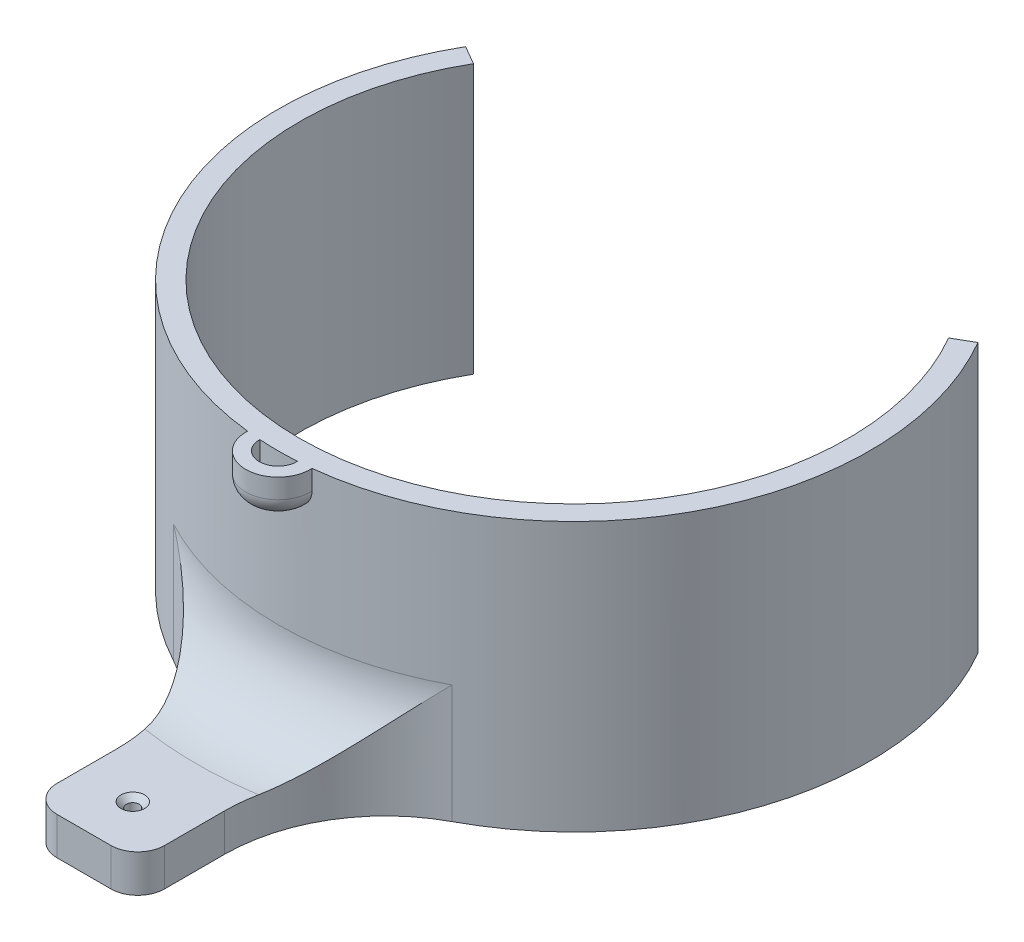
ISO-10303-21;
HEADER;
FILE_DESCRIPTION(('STEP AP214'),'2;1');
FILE_NAME('part.step','',(''),(''),'','','');
FILE_SCHEMA(('AUTOMOTIVE_DESIGN { 1 0 10303 214 1 1 1 1 }'));
ENDSEC;
DATA;
#1=APPLICATION_CONTEXT('core data for automotive mechanical design processes');
#2=APPLICATION_PROTOCOL_DEFINITION('international standard','automotive_design',2000,#1);
#3=PRODUCT_CONTEXT('',#1,'mechanical');
#4=PRODUCT('Part','Part','',(#3));
#5=PRODUCT_RELATED_PRODUCT_CATEGORY('part','',(#4));
#6=PRODUCT_DEFINITION_FORMATION('','',#4);
#7=PRODUCT_DEFINITION_CONTEXT('part definition',#1,'design');
#8=PRODUCT_DEFINITION('design','',#6,#7);
#9=PRODUCT_DEFINITION_SHAPE('','',#8);
#10=(LENGTH_UNIT() NAMED_UNIT(*) SI_UNIT(.MILLI.,.METRE.));
#11=(NAMED_UNIT(*) PLANE_ANGLE_UNIT() SI_UNIT($,.RADIAN.));
#12=(NAMED_UNIT(*) SI_UNIT($,.STERADIAN.) SOLID_ANGLE_UNIT());
#13=UNCERTAINTY_MEASURE_WITH_UNIT(LENGTH_MEASURE(1.E-05),#10,'distance_accuracy_value','');
#14=(GEOMETRIC_REPRESENTATION_CONTEXT(3) GLOBAL_UNCERTAINTY_ASSIGNED_CONTEXT((#13)) GLOBAL_UNIT_ASSIGNED_CONTEXT((#10,
#11,#12)) REPRESENTATION_CONTEXT('',''));
#15=CARTESIAN_POINT('',(0.,0.,0.));
#16=DIRECTION('',(0.,0.,1.));
#17=DIRECTION('',(1.,0.,0.));
#18=AXIS2_PLACEMENT_3D('',#15,#16,#17);
#19=CARTESIAN_POINT('',(0.,50.,0.));
#20=DIRECTION('',(0.,-1.,0.));
#21=DIRECTION('',(0.,0.,-1.));
#22=AXIS2_PLACEMENT_3D('',#19,#20,#21);
#23=CYLINDRICAL_SURFACE('',#22,55.);
#24=DIRECTION('',(0.,1.,0.));
#25=VECTOR('',#24,1.);
#26=CARTESIAN_POINT('',(3.4982278571436,43.,54.8886363636364));
#27=LINE('',#26,#25);
#28=CARTESIAN_POINT('',(3.4982278571436,43.,54.8886363636364));
#29=VERTEX_POINT('',#28);
#30=CARTESIAN_POINT('',(3.4982278571436,50.,54.8886363636364));
#31=VERTEX_POINT('',#30);
#32=EDGE_CURVE('E174',#29,#31,#27,.T.);
#33=ORIENTED_EDGE('',*,*,#32,.T.);
#34=CARTESIAN_POINT('',(0.,50.,0.));
#35=DIRECTION('',(0.,1.,0.));
#36=DIRECTION('',(0.,0.,1.));
#37=AXIS2_PLACEMENT_3D('',#34,#35,#36);
#38=CIRCLE('',#37,55.);
#39=CARTESIAN_POINT('',(-3.4982278571436,50.,54.8886363636364));
#40=VERTEX_POINT('',#39);
#41=EDGE_CURVE('E179',#40,#31,#38,.T.);
#42=ORIENTED_EDGE('',*,*,#41,.F.);
#43=DIRECTION('',(0.,1.,0.));
#44=VECTOR('',#43,1.);
#45=CARTESIAN_POINT('',(-3.4982278571436,43.,54.8886363636364));
#46=LINE('',#45,#44);
#47=CARTESIAN_POINT('',(-3.4982278571436,43.,54.8886363636364));
#48=VERTEX_POINT('',#47);
#49=EDGE_CURVE('E171',#48,#40,#46,.T.);
#50=ORIENTED_EDGE('',*,*,#49,.F.);
#51=CARTESIAN_POINT('',(-3.4982278571436,43.,54.8886363636364));
#52=CARTESIAN_POINT('',(-3.59236589939803,43.0280994679645,54.8826386470958));
#53=CARTESIAN_POINT('',(-3.68529652107505,43.060189742269,54.8764707437336));
#54=CARTESIAN_POINT('',(-3.86810201053047,43.1320834263016,54.8638872410639));
#55=CARTESIAN_POINT('',(-3.95797703763329,43.171886433146,54.8574716547084));
#56=CARTESIAN_POINT('',(-4.13399274128955,43.2589165357481,54.8444883327277));
#57=CARTESIAN_POINT('',(-4.2201354128056,43.3061396014045,54.8379206813361));
#58=CARTESIAN_POINT('',(-4.38810743930372,43.407662172986,54.8247354738007));
#59=CARTESIAN_POINT('',(-4.46993684233435,43.4619616000591,54.8181179182137));
#60=CARTESIAN_POINT('',(-4.70816425054198,43.6349987278606,54.79834404445));
#61=CARTESIAN_POINT('',(-4.85736753230153,43.7639080211404,54.7852615529017));
#62=CARTESIAN_POINT('',(-5.13191310629586,44.044923892924,54.760227959575));
#63=CARTESIAN_POINT('',(-5.25726134994016,44.1970246684628,54.7482765759801));
#64=CARTESIAN_POINT('',(-5.48080430955154,44.5203107590953,54.7263503743881));
#65=CARTESIAN_POINT('',(-5.57898224604407,44.6915077762431,54.7163767788796));
#66=CARTESIAN_POINT('',(-5.74528574406083,45.0480658424115,54.6991657865944));
#67=CARTESIAN_POINT('',(-5.81341213704638,45.2334264993882,54.6919283141159));
#68=CARTESIAN_POINT('',(-5.90717012685673,45.5746779982833,54.6818714594294));
#69=CARTESIAN_POINT('',(-5.93860018080981,45.7289754071481,54.6784555059691));
#70=CARTESIAN_POINT('',(-5.97006050466406,45.9623972320611,54.6750260823127));
#71=CARTESIAN_POINT('',(-5.97793314296291,46.0405129633809,54.6741653626302));
#72=CARTESIAN_POINT('',(-5.98843767594952,46.1971130718313,54.6730155311704));
#73=CARTESIAN_POINT('',(-5.9910687105276,46.275597507346,54.6727265132053));
#74=CARTESIAN_POINT('',(-5.99106773138006,46.3541019662497,54.6727272727273));
#75=B_SPLINE_CURVE_WITH_KNOTS('',3,(#51,#52,#53,#54,#55,#56,#57,#58,#59,#60,#61,#62,#63,#64,#65,
#66,#67,#68,#69,#70,#71,#72,#73,#74),.UNSPECIFIED.,.F.,.F.,(4,2,2,2,2,2,2,2,2,2,2,4),(0.,
0.295179197477141,0.590342980080407,0.885346999248032,1.18034773146109,1.7701302470265,
2.35976542885411,2.94976394119849,3.53974612853427,4.01077466446842,4.24616500122413,
4.48159396067005),.UNSPECIFIED.);
#76=CARTESIAN_POINT('',(-5.99106773138009,46.3541019662497,54.6727272727273));
#77=VERTEX_POINT('',#76);
#78=EDGE_CURVE('E11',#48,#77,#75,.T.);
#79=ORIENTED_EDGE('',*,*,#78,.T.);
#80=DIRECTION('',(0.,1.,0.));
#81=VECTOR('',#80,1.);
#82=CARTESIAN_POINT('',(-5.99106773138009,43.,54.6727272727273));
#83=LINE('',#82,#81);
#84=CARTESIAN_POINT('',(-5.99106773138009,50.,54.6727272727273));
#85=VERTEX_POINT('',#84);
#86=EDGE_CURVE('E181',#77,#85,#83,.T.);
#87=ORIENTED_EDGE('',*,*,#86,.T.);
#88=CARTESIAN_POINT('',(-47.6313972081442,50.,-27.4999999999999));
#89=VERTEX_POINT('',#88);
#90=EDGE_CURVE('E302',#89,#85,#38,.T.);
#91=ORIENTED_EDGE('',*,*,#90,.F.);
#92=DIRECTION('',(0.,-1.,0.));
#93=VECTOR('',#92,1.);
#94=CARTESIAN_POINT('',(-47.6313972081442,50.,-27.4999999999999));
#95=LINE('',#94,#93);
#96=CARTESIAN_POINT('',(-47.6313972081442,0.,-27.4999999999999));
#97=VERTEX_POINT('',#96);
#98=EDGE_CURVE('E291',#89,#97,#95,.T.);
#99=ORIENTED_EDGE('',*,*,#98,.T.);
#100=CARTESIAN_POINT('',(0.,0.,0.));
#101=DIRECTION('',(0.,1.,0.));
#102=DIRECTION('',(0.,0.,1.));
#103=AXIS2_PLACEMENT_3D('',#100,#101,#102);
#104=CIRCLE('',#103,55.);
#105=CARTESIAN_POINT('',(-25.8823529411765,0.,48.5294117647059));
#106=VERTEX_POINT('',#105);
#107=EDGE_CURVE('E311',#97,#106,#104,.T.);
#108=ORIENTED_EDGE('',*,*,#107,.T.);
#109=DIRECTION('',(0.,-1.,0.));
#110=VECTOR('',#109,1.);
#111=CARTESIAN_POINT('',(-25.8823529411765,50.,48.5294117647059));
#112=LINE('',#111,#110);
#113=CARTESIAN_POINT('',(-25.8823529411765,22.,48.5294117647059));
#114=VERTEX_POINT('',#113);
#115=EDGE_CURVE('E259',#106,#114,#112,.F.);
#116=ORIENTED_EDGE('',*,*,#115,.T.);
#117=CARTESIAN_POINT('',(0.,22.,0.));
#118=DIRECTION('',(0.,1.,0.));
#119=DIRECTION('',(0.,0.,1.));
#120=AXIS2_PLACEMENT_3D('',#117,#118,#119);
#121=CIRCLE('',#120,55.);
#122=CARTESIAN_POINT('',(25.8823529411765,22.,48.5294117647059));
#123=VERTEX_POINT('',#122);
#124=EDGE_CURVE('E256',#114,#123,#121,.T.);
#125=ORIENTED_EDGE('',*,*,#124,.T.);
#126=DIRECTION('',(0.,-1.,0.));
#127=VECTOR('',#126,1.);
#128=CARTESIAN_POINT('',(25.8823529411765,50.,48.5294117647059));
#129=LINE('',#128,#127);
#130=CARTESIAN_POINT('',(25.8823529411765,0.,48.5294117647059));
#131=VERTEX_POINT('',#130);
#132=EDGE_CURVE('E285',#123,#131,#129,.T.);
#133=ORIENTED_EDGE('',*,*,#132,.T.);
#134=CARTESIAN_POINT('',(47.6313972081442,0.,-27.4999999999999));
#135=VERTEX_POINT('',#134);
#136=EDGE_CURVE('E316',#131,#135,#104,.T.);
#137=ORIENTED_EDGE('',*,*,#136,.T.);
#138=DIRECTION('',(0.,-1.,0.));
#139=VECTOR('',#138,1.);
#140=CARTESIAN_POINT('',(47.6313972081442,50.,-27.4999999999999));
#141=LINE('',#140,#139);
#142=CARTESIAN_POINT('',(47.6313972081442,50.,-27.4999999999999));
#143=VERTEX_POINT('',#142);
#144=EDGE_CURVE('E305',#143,#135,#141,.T.);
#145=ORIENTED_EDGE('',*,*,#144,.F.);
#146=CARTESIAN_POINT('',(5.99106773138007,50.,54.6727272727273));
#147=VERTEX_POINT('',#146);
#148=EDGE_CURVE('E333',#147,#143,#38,.T.);
#149=ORIENTED_EDGE('',*,*,#148,.F.);
#150=DIRECTION('',(0.,1.,0.));
#151=VECTOR('',#150,1.);
#152=CARTESIAN_POINT('',(5.99106773138007,43.,54.6727272727273));
#153=LINE('',#152,#151);
#154=CARTESIAN_POINT('',(5.99106773138007,46.3541019662497,54.6727272727273));
#155=VERTEX_POINT('',#154);
#156=EDGE_CURVE('E402',#155,#147,#153,.T.);
#157=ORIENTED_EDGE('',*,*,#156,.F.);
#158=CARTESIAN_POINT('',(5.99106773138006,46.3541019662497,54.6727272727273));
#159=CARTESIAN_POINT('',(5.99107704048775,46.2557594990792,54.6727242746912));
#160=CARTESIAN_POINT('',(5.98694147052313,46.1574215863967,54.6731793791688));
#161=CARTESIAN_POINT('',(5.97045267366293,45.9614502782098,54.6749835011302));
#162=CARTESIAN_POINT('',(5.95809986937495,45.8638168467353,54.6763324726429));
#163=CARTESIAN_POINT('',(5.92525831866172,45.6699964703308,54.6799009948234));
#164=CARTESIAN_POINT('',(5.90477434512921,45.573808711125,54.6821200347626));
#165=CARTESIAN_POINT('',(5.85583560193797,45.3835347009849,54.6873823581637));
#166=CARTESIAN_POINT('',(5.82738092683521,45.2894484251351,54.6904256318476));
#167=CARTESIAN_POINT('',(5.73029489767891,45.0112661713124,54.70071321461));
#168=CARTESIAN_POINT('',(5.64992504622497,44.831149936001,54.7091171441249));
#169=CARTESIAN_POINT('',(5.46027618855174,44.4871676370778,54.7283692531778));
#170=CARTESIAN_POINT('',(5.35100409658067,44.3232976997571,54.7392168480288));
#171=CARTESIAN_POINT('',(5.10647195436394,44.0161134782509,54.7625694140833));
#172=CARTESIAN_POINT('',(4.97118813324506,43.8728182071159,54.7750758979988));
#173=CARTESIAN_POINT('',(4.6784833841054,43.6110335664822,54.8008513844837));
#174=CARTESIAN_POINT('',(4.52106279658007,43.4925438155084,54.8141203753229));
#175=CARTESIAN_POINT('',(4.22160996388238,43.3044795946098,54.8379054481945));
#176=CARTESIAN_POINT('',(4.08272668808632,43.2298641711928,54.8484451102197));
#177=CARTESIAN_POINT('',(3.86793502663299,43.1325493767179,54.8638701006365));
#178=CARTESIAN_POINT('',(3.79528000900752,43.1025518166073,54.8689463934396));
#179=CARTESIAN_POINT('',(3.64808842841823,43.0475218938721,54.8789295145203));
#180=CARTESIAN_POINT('',(3.57355156035553,43.0224903422751,54.8838363150092));
#181=CARTESIAN_POINT('',(3.4982278571436,43.,54.8886363636364));
#182=B_SPLINE_CURVE_WITH_KNOTS('',3,(#158,#159,#160,#161,#162,#163,#164,#165,#166,#167,#168,
#169,#170,#171,#172,#173,#174,#175,#176,#177,#178,#179,#180,#181),.UNSPECIFIED.,.F.,.F.,(4,2,2,
2,2,2,2,2,2,2,2,4),(0.,0.29493122707464,0.589847287180124,0.88459049069748,1.17933019784158,
1.7685185957765,2.3575661701649,2.94715462759552,3.53673401729574,4.00927151096279,
4.24541585207084,4.48159872758792),.UNSPECIFIED.);
#183=EDGE_CURVE('E59',#155,#29,#182,.T.);
#184=ORIENTED_EDGE('',*,*,#183,.T.);
#185=EDGE_LOOP('',(#33,#42,#50,#79,#87,#91,#99,#108,#116,#125,#133,#137,#145,#149,#157,#184));
#186=FACE_BOUND('',#185,.T.);
#187=ADVANCED_FACE('F44',(#186),#23,.T.);
#188=CARTESIAN_POINT('',(-47.6313972081442,50.,-27.4999999999999));
#189=DIRECTION('',(0.499999999999999,0.,-0.866025403784439));
#190=DIRECTION('',(-0.866025403784439,0.,-0.5));
#191=AXIS2_PLACEMENT_3D('',#188,#189,#190);
#192=PLANE('',#191);
#193=DIRECTION('',(0.866025403784439,0.,0.499999999999999));
#194=VECTOR('',#193,1.);
#195=CARTESIAN_POINT('',(-47.6313972081442,0.,-27.4999999999999));
#196=LINE('',#195,#194);
#197=CARTESIAN_POINT('',(-44.1672955930064,0.,-25.4999999999999));
#198=VERTEX_POINT('',#197);
#199=EDGE_CURVE('E325',#97,#198,#196,.T.);
#200=ORIENTED_EDGE('',*,*,#199,.F.);
#201=ORIENTED_EDGE('',*,*,#98,.F.);
#202=DIRECTION('',(0.866025403784439,0.,0.499999999999999));
#203=VECTOR('',#202,1.);
#204=CARTESIAN_POINT('',(-47.6313972081442,50.,-27.4999999999999));
#205=LINE('',#204,#203);
#206=CARTESIAN_POINT('',(-44.1672955930064,50.,-25.4999999999999));
#207=VERTEX_POINT('',#206);
#208=EDGE_CURVE('E315',#89,#207,#205,.T.);
#209=ORIENTED_EDGE('',*,*,#208,.T.);
#210=DIRECTION('',(0.,-1.,0.));
#211=VECTOR('',#210,1.);
#212=CARTESIAN_POINT('',(-44.1672955930064,50.,-25.4999999999999));
#213=LINE('',#212,#211);
#214=EDGE_CURVE('E298',#207,#198,#213,.T.);
#215=ORIENTED_EDGE('',*,*,#214,.T.);
#216=EDGE_LOOP('',(#200,#201,#209,#215));
#217=FACE_BOUND('',#216,.T.);
#218=ADVANCED_FACE('F208',(#217),#192,.T.);
#219=CARTESIAN_POINT('',(44.1672955930064,50.,-25.4999999999999));
#220=DIRECTION('',(-0.499999999999998,0.,-0.86602540378444));
#221=DIRECTION('',(-0.86602540378444,0.,0.499999999999998));
#222=AXIS2_PLACEMENT_3D('',#219,#220,#221);
#223=PLANE('',#222);
#224=DIRECTION('',(0.86602540378444,0.,-0.499999999999998));
#225=VECTOR('',#224,1.);
#226=CARTESIAN_POINT('',(44.1672955930064,0.,-25.4999999999999));
#227=LINE('',#226,#225);
#228=CARTESIAN_POINT('',(44.1672955930064,0.,-25.4999999999999));
#229=VERTEX_POINT('',#228);
#230=EDGE_CURVE('E317',#229,#135,#227,.T.);
#231=ORIENTED_EDGE('',*,*,#230,.F.);
#232=DIRECTION('',(0.,-1.,0.));
#233=VECTOR('',#232,1.);
#234=CARTESIAN_POINT('',(44.1672955930064,50.,-25.4999999999999));
#235=LINE('',#234,#233);
#236=CARTESIAN_POINT('',(44.1672955930064,50.,-25.4999999999999));
#237=VERTEX_POINT('',#236);
#238=EDGE_CURVE('E301',#237,#229,#235,.T.);
#239=ORIENTED_EDGE('',*,*,#238,.F.);
#240=DIRECTION('',(0.86602540378444,0.,-0.499999999999998));
#241=VECTOR('',#240,1.);
#242=CARTESIAN_POINT('',(44.1672955930064,50.,-25.4999999999999));
#243=LINE('',#242,#241);
#244=EDGE_CURVE('E334',#237,#143,#243,.T.);
#245=ORIENTED_EDGE('',*,*,#244,.T.);
#246=ORIENTED_EDGE('',*,*,#144,.T.);
#247=EDGE_LOOP('',(#231,#239,#245,#246));
#248=FACE_BOUND('',#247,.T.);
#249=ADVANCED_FACE('F211',(#248),#223,.T.);
#250=CARTESIAN_POINT('',(0.,50.,0.));
#251=DIRECTION('',(0.,-1.,0.));
#252=DIRECTION('',(0.,0.,-1.));
#253=AXIS2_PLACEMENT_3D('',#250,#251,#252);
#254=CYLINDRICAL_SURFACE('',#253,51.);
#255=CARTESIAN_POINT('',(0.,0.,0.));
#256=DIRECTION('',(0.,1.,0.));
#257=DIRECTION('',(0.,0.,1.));
#258=AXIS2_PLACEMENT_3D('',#255,#256,#257);
#259=CIRCLE('',#258,51.);
#260=EDGE_CURVE('E321',#198,#229,#259,.T.);
#261=ORIENTED_EDGE('',*,*,#260,.F.);
#262=ORIENTED_EDGE('',*,*,#214,.F.);
#263=CARTESIAN_POINT('',(0.,50.,0.));
#264=DIRECTION('',(0.,1.,0.));
#265=DIRECTION('',(0.,0.,1.));
#266=AXIS2_PLACEMENT_3D('',#263,#264,#265);
#267=CIRCLE('',#266,51.);
#268=EDGE_CURVE('E338',#207,#237,#267,.T.);
#269=ORIENTED_EDGE('',*,*,#268,.T.);
#270=ORIENTED_EDGE('',*,*,#238,.T.);
#271=EDGE_LOOP('',(#261,#262,#269,#270));
#272=FACE_BOUND('',#271,.T.);
#273=ADVANCED_FACE('F215',(#272),#254,.F.);
#274=CARTESIAN_POINT('',(0.,50.,0.));
#275=DIRECTION('',(0.,1.,0.));
#276=DIRECTION('',(0.,0.,1.));
#277=AXIS2_PLACEMENT_3D('',#274,#275,#276);
#278=PLANE('',#277);
#279=CARTESIAN_POINT('',(0.,50.,55.));
#280=DIRECTION('',(0.,1.,0.));
#281=DIRECTION('',(0.,0.,1.));
#282=AXIS2_PLACEMENT_3D('',#279,#280,#281);
#283=CIRCLE('',#282,6.);
#284=EDGE_CURVE('E176',#85,#147,#283,.T.);
#285=ORIENTED_EDGE('',*,*,#284,.T.);
#286=ORIENTED_EDGE('',*,*,#148,.T.);
#287=ORIENTED_EDGE('',*,*,#244,.F.);
#288=ORIENTED_EDGE('',*,*,#268,.F.);
#289=ORIENTED_EDGE('',*,*,#208,.F.);
#290=ORIENTED_EDGE('',*,*,#90,.T.);
#291=EDGE_LOOP('',(#285,#286,#287,#288,#289,#290));
#292=FACE_BOUND('',#291,.T.);
#293=ORIENTED_EDGE('',*,*,#41,.T.);
#294=CARTESIAN_POINT('',(0.,50.,55.));
#295=DIRECTION('',(0.,1.,0.));
#296=DIRECTION('',(0.,0.,1.));
#297=AXIS2_PLACEMENT_3D('',#294,#295,#296);
#298=CIRCLE('',#297,3.49999999999994);
#299=EDGE_CURVE('E410',#40,#31,#298,.T.);
#300=ORIENTED_EDGE('',*,*,#299,.F.);
#301=EDGE_LOOP('',(#293,#300));
#302=FACE_BOUND('',#301,.T.);
#303=ADVANCED_FACE('F219',(#292,#302),#278,.T.);
#304=CARTESIAN_POINT('',(0.,0.,0.));
#305=DIRECTION('',(0.,1.,0.));
#306=DIRECTION('',(0.,0.,1.));
#307=AXIS2_PLACEMENT_3D('',#304,#305,#306);
#308=PLANE('',#307);
#309=CARTESIAN_POINT('',(0.,0.,82.));
#310=DIRECTION('',(0.,1.,0.));
#311=DIRECTION('',(0.,0.,1.));
#312=AXIS2_PLACEMENT_3D('',#309,#310,#311);
#313=CIRCLE('',#312,1.19999999999999);
#314=CARTESIAN_POINT('',(0.,0.,83.2));
#315=VERTEX_POINT('',#314);
#316=EDGE_CURVE('E292',#315,#315,#313,.T.);
#317=ORIENTED_EDGE('',*,*,#316,.T.);
#318=EDGE_LOOP('',(#317));
#319=FACE_BOUND('',#318,.T.);
#320=ORIENTED_EDGE('',*,*,#199,.T.);
#321=ORIENTED_EDGE('',*,*,#260,.T.);
#322=ORIENTED_EDGE('',*,*,#230,.T.);
#323=ORIENTED_EDGE('',*,*,#136,.F.);
#324=CARTESIAN_POINT('',(40.,0.,75.));
#325=DIRECTION('',(0.,1.,0.));
#326=DIRECTION('',(0.,0.,1.));
#327=AXIS2_PLACEMENT_3D('',#324,#325,#326);
#328=CIRCLE('',#327,30.);
#329=CARTESIAN_POINT('',(10.,0.,75.));
#330=VERTEX_POINT('',#329);
#331=EDGE_CURVE('E277',#131,#330,#328,.T.);
#332=ORIENTED_EDGE('',*,*,#331,.T.);
#333=DIRECTION('',(0.,0.,-1.));
#334=VECTOR('',#333,1.);
#335=CARTESIAN_POINT('',(10.,0.,0.));
#336=LINE('',#335,#334);
#337=CARTESIAN_POINT('',(10.,0.,86.0832691319598));
#338=VERTEX_POINT('',#337);
#339=EDGE_CURVE('E362',#338,#330,#336,.T.);
#340=ORIENTED_EDGE('',*,*,#339,.F.);
#341=CARTESIAN_POINT('',(5.00000000000001,0.,86.0832691319598));
#342=DIRECTION('',(0.,1.,0.));
#343=DIRECTION('',(0.,0.,1.));
#344=AXIS2_PLACEMENT_3D('',#341,#342,#343);
#345=CIRCLE('',#344,5.00000000000001);
#346=CARTESIAN_POINT('',(5.00000000000001,0.,91.0832691319598));
#347=VERTEX_POINT('',#346);
#348=EDGE_CURVE('E366',#338,#347,#345,.F.);
#349=ORIENTED_EDGE('',*,*,#348,.T.);
#350=DIRECTION('',(1.,0.,0.));
#351=VECTOR('',#350,1.);
#352=CARTESIAN_POINT('',(0.,0.,91.0832691319598));
#353=LINE('',#352,#351);
#354=CARTESIAN_POINT('',(-5.00000000000001,0.,91.0832691319598));
#355=VERTEX_POINT('',#354);
#356=EDGE_CURVE('E370',#355,#347,#353,.T.);
#357=ORIENTED_EDGE('',*,*,#356,.F.);
#358=CARTESIAN_POINT('',(-5.00000000000001,0.,86.0832691319598));
#359=DIRECTION('',(0.,1.,0.));
#360=DIRECTION('',(0.,0.,1.));
#361=AXIS2_PLACEMENT_3D('',#358,#359,#360);
#362=CIRCLE('',#361,5.00000000000001);
#363=CARTESIAN_POINT('',(-10.,0.,86.0832691319598));
#364=VERTEX_POINT('',#363);
#365=EDGE_CURVE('E296',#355,#364,#362,.F.);
#366=ORIENTED_EDGE('',*,*,#365,.T.);
#367=DIRECTION('',(0.,0.,1.));
#368=VECTOR('',#367,1.);
#369=CARTESIAN_POINT('',(-10.,0.,0.));
#370=LINE('',#369,#368);
#371=CARTESIAN_POINT('',(-10.,0.,75.));
#372=VERTEX_POINT('',#371);
#373=EDGE_CURVE('E358',#372,#364,#370,.T.);
#374=ORIENTED_EDGE('',*,*,#373,.F.);
#375=CARTESIAN_POINT('',(-40.,0.,75.));
#376=DIRECTION('',(0.,1.,0.));
#377=DIRECTION('',(0.,0.,1.));
#378=AXIS2_PLACEMENT_3D('',#375,#376,#377);
#379=CIRCLE('',#378,30.);
#380=EDGE_CURVE('E267',#372,#106,#379,.T.);
#381=ORIENTED_EDGE('',*,*,#380,.T.);
#382=ORIENTED_EDGE('',*,*,#107,.F.);
#383=EDGE_LOOP('',(#320,#321,#322,#323,#332,#340,#349,#357,#366,#374,#381,#382));
#384=FACE_BOUND('',#383,.T.);
#385=ADVANCED_FACE('F209',(#319,#384),#308,.F.);
#386=CARTESIAN_POINT('',(-5.00000000000001,7.,86.0832691319598));
#387=DIRECTION('',(0.,-1.,0.));
#388=DIRECTION('',(0.,0.,-1.));
#389=AXIS2_PLACEMENT_3D('',#386,#387,#388);
#390=CYLINDRICAL_SURFACE('',#389,5.00000000000001);
#391=ORIENTED_EDGE('',*,*,#365,.F.);
#392=DIRECTION('',(0.,-1.,0.));
#393=VECTOR('',#392,1.);
#394=CARTESIAN_POINT('',(-5.00000000000001,7.,91.0832691319598));
#395=LINE('',#394,#393);
#396=CARTESIAN_POINT('',(-5.00000000000001,7.,91.0832691319598));
#397=VERTEX_POINT('',#396);
#398=EDGE_CURVE('E329',#397,#355,#395,.T.);
#399=ORIENTED_EDGE('',*,*,#398,.F.);
#400=CARTESIAN_POINT('',(-5.00000000000001,7.,86.0832691319598));
#401=DIRECTION('',(0.,1.,0.));
#402=DIRECTION('',(0.,0.,1.));
#403=AXIS2_PLACEMENT_3D('',#400,#401,#402);
#404=CIRCLE('',#403,5.00000000000001);
#405=CARTESIAN_POINT('',(-10.,7.,86.0832691319598));
#406=VERTEX_POINT('',#405);
#407=EDGE_CURVE('E361',#397,#406,#404,.F.);
#408=ORIENTED_EDGE('',*,*,#407,.T.);
#409=DIRECTION('',(0.,-1.,0.));
#410=VECTOR('',#409,1.);
#411=CARTESIAN_POINT('',(-10.,7.,86.0832691319598));
#412=LINE('',#411,#410);
#413=EDGE_CURVE('E353',#406,#364,#412,.T.);
#414=ORIENTED_EDGE('',*,*,#413,.T.);
#415=EDGE_LOOP('',(#391,#399,#408,#414));
#416=FACE_BOUND('',#415,.T.);
#417=ADVANCED_FACE('F460',(#416),#390,.T.);
#418=CARTESIAN_POINT('',(0.,7.,91.0832691319598));
#419=DIRECTION('',(0.,0.,-1.));
#420=DIRECTION('',(-1.,0.,0.));
#421=AXIS2_PLACEMENT_3D('',#418,#419,#420);
#422=PLANE('',#421);
#423=ORIENTED_EDGE('',*,*,#356,.T.);
#424=DIRECTION('',(0.,-1.,0.));
#425=VECTOR('',#424,1.);
#426=CARTESIAN_POINT('',(5.00000000000001,7.,91.0832691319598));
#427=LINE('',#426,#425);
#428=CARTESIAN_POINT('',(5.00000000000001,7.,91.0832691319598));
#429=VERTEX_POINT('',#428);
#430=EDGE_CURVE('E347',#429,#347,#427,.T.);
#431=ORIENTED_EDGE('',*,*,#430,.F.);
#432=DIRECTION('',(1.,0.,0.));
#433=VECTOR('',#432,1.);
#434=CARTESIAN_POINT('',(0.,7.,91.0832691319598));
#435=LINE('',#434,#433);
#436=EDGE_CURVE('E387',#397,#429,#435,.T.);
#437=ORIENTED_EDGE('',*,*,#436,.F.);
#438=ORIENTED_EDGE('',*,*,#398,.T.);
#439=EDGE_LOOP('',(#423,#431,#437,#438));
#440=FACE_BOUND('',#439,.T.);
#441=ADVANCED_FACE('F456',(#440),#422,.F.);
#442=CARTESIAN_POINT('',(5.00000000000001,7.,86.0832691319598));
#443=DIRECTION('',(0.,-1.,0.));
#444=DIRECTION('',(0.,0.,-1.));
#445=AXIS2_PLACEMENT_3D('',#442,#443,#444);
#446=CYLINDRICAL_SURFACE('',#445,5.00000000000001);
#447=ORIENTED_EDGE('',*,*,#348,.F.);
#448=DIRECTION('',(0.,-1.,0.));
#449=VECTOR('',#448,1.);
#450=CARTESIAN_POINT('',(10.,7.,86.0832691319598));
#451=LINE('',#450,#449);
#452=CARTESIAN_POINT('',(10.,7.,86.0832691319598));
#453=VERTEX_POINT('',#452);
#454=EDGE_CURVE('E350',#453,#338,#451,.T.);
#455=ORIENTED_EDGE('',*,*,#454,.F.);
#456=CARTESIAN_POINT('',(5.00000000000001,7.,86.0832691319598));
#457=DIRECTION('',(0.,1.,0.));
#458=DIRECTION('',(0.,0.,1.));
#459=AXIS2_PLACEMENT_3D('',#456,#457,#458);
#460=CIRCLE('',#459,5.00000000000001);
#461=EDGE_CURVE('E383',#453,#429,#460,.F.);
#462=ORIENTED_EDGE('',*,*,#461,.T.);
#463=ORIENTED_EDGE('',*,*,#430,.T.);
#464=EDGE_LOOP('',(#447,#455,#462,#463));
#465=FACE_BOUND('',#464,.T.);
#466=ADVANCED_FACE('F452',(#465),#446,.T.);
#467=CARTESIAN_POINT('',(10.,7.,0.));
#468=DIRECTION('',(-1.,0.,0.));
#469=DIRECTION('',(0.,0.,1.));
#470=AXIS2_PLACEMENT_3D('',#467,#468,#469);
#471=PLANE('',#470);
#472=ORIENTED_EDGE('',*,*,#339,.T.);
#473=DIRECTION('',(0.,1.,0.));
#474=VECTOR('',#473,1.);
#475=CARTESIAN_POINT('',(10.,7.,75.));
#476=LINE('',#475,#474);
#477=CARTESIAN_POINT('',(10.,7.,75.));
#478=VERTEX_POINT('',#477);
#479=EDGE_CURVE('E282',#330,#478,#476,.T.);
#480=ORIENTED_EDGE('',*,*,#479,.T.);
#481=DIRECTION('',(0.,0.,-1.));
#482=VECTOR('',#481,1.);
#483=CARTESIAN_POINT('',(10.,7.,0.));
#484=LINE('',#483,#482);
#485=EDGE_CURVE('E379',#453,#478,#484,.T.);
#486=ORIENTED_EDGE('',*,*,#485,.F.);
#487=ORIENTED_EDGE('',*,*,#454,.T.);
#488=EDGE_LOOP('',(#472,#480,#486,#487));
#489=FACE_BOUND('',#488,.T.);
#490=ADVANCED_FACE('F448',(#489),#471,.F.);
#491=CARTESIAN_POINT('',(-10.,7.,0.));
#492=DIRECTION('',(1.,0.,0.));
#493=DIRECTION('',(0.,0.,-1.));
#494=AXIS2_PLACEMENT_3D('',#491,#492,#493);
#495=PLANE('',#494);
#496=DIRECTION('',(0.,0.,1.));
#497=VECTOR('',#496,1.);
#498=CARTESIAN_POINT('',(-10.,7.,0.));
#499=LINE('',#498,#497);
#500=CARTESIAN_POINT('',(-10.,7.,75.));
#501=VERTEX_POINT('',#500);
#502=EDGE_CURVE('E357',#501,#406,#499,.T.);
#503=ORIENTED_EDGE('',*,*,#502,.F.);
#504=DIRECTION('',(0.,1.,0.));
#505=VECTOR('',#504,1.);
#506=CARTESIAN_POINT('',(-10.,0.,75.));
#507=LINE('',#506,#505);
#508=EDGE_CURVE('E263',#501,#372,#507,.F.);
#509=ORIENTED_EDGE('',*,*,#508,.T.);
#510=ORIENTED_EDGE('',*,*,#373,.T.);
#511=ORIENTED_EDGE('',*,*,#413,.F.);
#512=EDGE_LOOP('',(#503,#509,#510,#511));
#513=FACE_BOUND('',#512,.T.);
#514=ADVANCED_FACE('F444',(#513),#495,.F.);
#515=CARTESIAN_POINT('',(0.,7.,0.));
#516=DIRECTION('',(0.,1.,0.));
#517=DIRECTION('',(0.,0.,1.));
#518=AXIS2_PLACEMENT_3D('',#515,#516,#517);
#519=PLANE('',#518);
#520=CARTESIAN_POINT('',(0.,7.,82.));
#521=DIRECTION('',(0.,1.,0.));
#522=DIRECTION('',(0.,0.,1.));
#523=AXIS2_PLACEMENT_3D('',#520,#521,#522);
#524=CIRCLE('',#523,2.2);
#525=CARTESIAN_POINT('',(0.,7.,84.2));
#526=VERTEX_POINT('',#525);
#527=EDGE_CURVE('E396',#526,#526,#524,.T.);
#528=ORIENTED_EDGE('',*,*,#527,.F.);
#529=EDGE_LOOP('',(#528));
#530=FACE_BOUND('',#529,.T.);
#531=CARTESIAN_POINT('',(40.,7.,75.));
#532=DIRECTION('',(0.,1.,0.));
#533=DIRECTION('',(0.,0.,1.));
#534=AXIS2_PLACEMENT_3D('',#531,#532,#533);
#535=CIRCLE('',#534,30.);
#536=CARTESIAN_POINT('',(10.5664178685825,7.,69.1979104700893));
#537=VERTEX_POINT('',#536);
#538=EDGE_CURVE('E271',#478,#537,#535,.F.);
#539=ORIENTED_EDGE('',*,*,#538,.T.);
#540=CARTESIAN_POINT('',(0.,7.,0.));
#541=DIRECTION('',(0.,1.,0.));
#542=DIRECTION('',(0.,0.,1.));
#543=AXIS2_PLACEMENT_3D('',#540,#541,#542);
#544=CIRCLE('',#543,70.);
#545=CARTESIAN_POINT('',(-10.5664178685825,7.,69.1979104700893));
#546=VERTEX_POINT('',#545);
#547=EDGE_CURVE('E237',#537,#546,#544,.F.);
#548=ORIENTED_EDGE('',*,*,#547,.T.);
#549=CARTESIAN_POINT('',(-40.,7.,75.));
#550=DIRECTION('',(0.,1.,0.));
#551=DIRECTION('',(0.,0.,1.));
#552=AXIS2_PLACEMENT_3D('',#549,#550,#551);
#553=CIRCLE('',#552,30.);
#554=EDGE_CURVE('E261',#546,#501,#553,.F.);
#555=ORIENTED_EDGE('',*,*,#554,.T.);
#556=ORIENTED_EDGE('',*,*,#502,.T.);
#557=ORIENTED_EDGE('',*,*,#407,.F.);
#558=ORIENTED_EDGE('',*,*,#436,.T.);
#559=ORIENTED_EDGE('',*,*,#461,.F.);
#560=ORIENTED_EDGE('',*,*,#485,.T.);
#561=EDGE_LOOP('',(#539,#548,#555,#556,#557,#558,#559,#560));
#562=FACE_BOUND('',#561,.T.);
#563=ADVANCED_FACE('F440',(#530,#562),#519,.T.);
#564=CARTESIAN_POINT('',(0.,7.,82.));
#565=DIRECTION('',(0.,1.,0.));
#566=DIRECTION('',(0.,0.,1.));
#567=AXIS2_PLACEMENT_3D('',#564,#565,#566);
#568=CYLINDRICAL_SURFACE('',#567,1.19999999999999);
#569=CARTESIAN_POINT('',(0.,6.,82.));
#570=DIRECTION('',(0.,1.,0.));
#571=DIRECTION('',(0.,0.,1.));
#572=AXIS2_PLACEMENT_3D('',#569,#570,#571);
#573=CIRCLE('',#572,1.2);
#574=CARTESIAN_POINT('',(0.,6.,83.2));
#575=VERTEX_POINT('',#574);
#576=EDGE_CURVE('E297',#575,#575,#573,.T.);
#577=ORIENTED_EDGE('',*,*,#576,.T.);
#578=EDGE_LOOP('',(#577));
#579=FACE_BOUND('',#578,.T.);
#580=ORIENTED_EDGE('',*,*,#316,.F.);
#581=EDGE_LOOP('',(#580));
#582=FACE_BOUND('',#581,.T.);
#583=ADVANCED_FACE('F436',(#579,#582),#568,.F.);
#584=CARTESIAN_POINT('',(0.,7.,82.));
#585=DIRECTION('',(0.,1.,0.));
#586=DIRECTION('',(0.,0.,1.));
#587=AXIS2_PLACEMENT_3D('',#584,#585,#586);
#588=CONICAL_SURFACE('',#587,2.2,0.785398163397447);
#589=ORIENTED_EDGE('',*,*,#576,.F.);
#590=EDGE_LOOP('',(#589));
#591=FACE_BOUND('',#590,.T.);
#592=ORIENTED_EDGE('',*,*,#527,.T.);
#593=EDGE_LOOP('',(#592));
#594=FACE_BOUND('',#593,.T.);
#595=ADVANCED_FACE('F228',(#591,#594),#588,.F.);
#596=CARTESIAN_POINT('',(40.,50.,75.));
#597=DIRECTION('',(0.,-1.,0.));
#598=DIRECTION('',(0.,0.,-1.));
#599=AXIS2_PLACEMENT_3D('',#596,#597,#598);
#600=CYLINDRICAL_SURFACE('',#599,30.);
#601=ORIENTED_EDGE('',*,*,#538,.F.);
#602=ORIENTED_EDGE('',*,*,#479,.F.);
#603=ORIENTED_EDGE('',*,*,#331,.F.);
#604=ORIENTED_EDGE('',*,*,#132,.F.);
#605=CARTESIAN_POINT('',(10.5664178685825,7.,69.1979104700893));
#606=CARTESIAN_POINT('',(10.6140278717148,6.99999723291753,68.9563652606622));
#607=CARTESIAN_POINT('',(10.6646111675147,7.00536422985765,68.71545705417));
#608=CARTESIAN_POINT('',(10.7715713372021,7.02646708344317,68.2354326161288));
#609=CARTESIAN_POINT('',(10.8279471109345,7.04220097418369,67.9963160535184));
#610=CARTESIAN_POINT('',(11.0053368917878,7.10432133564785,67.283200440549));
#611=CARTESIAN_POINT('',(11.1347959045347,7.16562937390402,66.8125115037353));
#612=CARTESIAN_POINT('',(11.4128088754009,7.32366271002709,65.8894448752112));
#613=CARTESIAN_POINT('',(11.5611119863451,7.41994908162104,65.4369142688871));
#614=CARTESIAN_POINT('',(11.8762790699155,7.64455314350845,64.5463110260065));
#615=CARTESIAN_POINT('',(12.0431527529692,7.77288763559099,64.1082461101717));
#616=CARTESIAN_POINT('',(12.4465329897914,8.10118060212298,63.1184216165079));
#617=CARTESIAN_POINT('',(12.6888421557543,8.3110635783394,62.5723132465928));
#618=CARTESIAN_POINT('',(13.1977974917458,8.77182957684938,61.5096576715426));
#619=CARTESIAN_POINT('',(13.4644489099575,9.02272144991119,60.9931168804126));
#620=CARTESIAN_POINT('',(14.0201447436626,9.56037705901951,59.9873706065251));
#621=CARTESIAN_POINT('',(14.3093040721109,9.84733019061482,59.4983307840595));
#622=CARTESIAN_POINT('',(14.9059047211674,10.4503096164467,58.5500654661907));
#623=CARTESIAN_POINT('',(15.2133528179624,10.7663467106315,58.0908511549512));
#624=CARTESIAN_POINT('',(15.7798905489498,11.3556680058582,57.2919550279701));
#625=CARTESIAN_POINT('',(16.036097084232,11.6245736420555,56.946958366753));
#626=CARTESIAN_POINT('',(16.5575440714016,12.1753989473569,56.274826054893));
#627=CARTESIAN_POINT('',(16.8227825485679,12.4573157764556,55.9476865402082));
#628=CARTESIAN_POINT('',(17.361748088672,13.0324942150884,55.3103108362422));
#629=CARTESIAN_POINT('',(17.6354809042212,13.3257635476606,55.0000865125211));
#630=CARTESIAN_POINT('',(18.1906656757781,13.9217933540422,54.3960876328991));
#631=CARTESIAN_POINT('',(18.4721180195953,14.2245543047959,54.1023139056975));
#632=CARTESIAN_POINT('',(19.0421250298823,14.8379098351496,53.5307124429063));
#633=CARTESIAN_POINT('',(19.33067624653,15.1485006114524,53.2528771722234));
#634=CARTESIAN_POINT('',(19.9146681219934,15.7763186914484,52.7123860355583));
#635=CARTESIAN_POINT('',(20.2101087586953,16.0935459738392,52.4497301208625));
#636=CARTESIAN_POINT('',(20.8075180177875,16.7332944845325,51.9391464778995));
#637=CARTESIAN_POINT('',(21.1094837475657,17.0558133523764,51.6912123989115));
#638=CARTESIAN_POINT('',(21.7199325683876,17.7051845407952,51.2094488733798));
#639=CARTESIAN_POINT('',(22.0284157286295,18.0320369073669,50.975619576694));
#640=CARTESIAN_POINT('',(22.6232198753246,18.6588925524085,50.5424828803014));
#641=CARTESIAN_POINT('',(22.9089749558117,18.9586054098248,50.3419770846476));
#642=CARTESIAN_POINT('',(23.4857867698387,19.5600101229405,49.952007579888));
#643=CARTESIAN_POINT('',(23.7768430406011,19.8617018044373,49.7625429129327));
#644=CARTESIAN_POINT('',(24.6574657115528,20.7681276750096,49.2107286929084));
#645=CARTESIAN_POINT('',(25.2551650032434,21.3749318377649,48.8644654591414));
#646=CARTESIAN_POINT('',(25.8700431239632,21.9877351330451,48.535979763102));
#647=CARTESIAN_POINT('',(25.8761974691864,21.9938675748293,48.5326946879204));
#648=CARTESIAN_POINT('',(25.8823529411765,22.,48.5294117647059));
#649=B_SPLINE_CURVE_WITH_KNOTS('',3,(#605,#606,#607,#608,#609,#610,#611,#612,#613,#614,#615,
#616,#617,#618,#619,#620,#621,#622,#623,#624,#625,#626,#627,#628,#629,#630,#631,#632,#633,#634,
#635,#636,#637,#638,#639,#640,#641,#642,#643,#644,#645,#646,#647,#648),.UNSPECIFIED.,.F.,.F.,(4,
2,2,2,2,2,2,2,2,2,2,2,2,2,2,2,2,2,2,2,2,4),(0.,0.738409888585763,1.47667979059544,
2.95040597190851,4.40624410482479,5.86284709468226,7.75966950679589,9.65690184354456,
11.5645511847153,13.4729117870559,14.9931217237853,16.5130013931669,18.0339338529113,
19.5549428608777,21.0752267652953,22.5955057905468,24.1151241590862,25.6347586701524,
27.0148584782196,28.3948383798862,31.1514859207842,31.1793511435812),.UNSPECIFIED.);
#650=EDGE_CURVE('E192',#123,#537,#649,.F.);
#651=ORIENTED_EDGE('',*,*,#650,.T.);
#652=EDGE_LOOP('',(#601,#602,#603,#604,#651));
#653=FACE_BOUND('',#652,.T.);
#654=ADVANCED_FACE('F224',(#653),#600,.F.);
#655=CARTESIAN_POINT('',(-40.,50.,75.));
#656=DIRECTION('',(0.,-1.,0.));
#657=DIRECTION('',(0.,0.,-1.));
#658=AXIS2_PLACEMENT_3D('',#655,#656,#657);
#659=CYLINDRICAL_SURFACE('',#658,30.);
#660=ORIENTED_EDGE('',*,*,#554,.F.);
#661=CARTESIAN_POINT('',(-10.5664178685825,7.,69.1979104700893));
#662=CARTESIAN_POINT('',(-10.6140278717148,6.99999723291753,68.9563652606622));
#663=CARTESIAN_POINT('',(-10.6646111675147,7.00536422985765,68.71545705417));
#664=CARTESIAN_POINT('',(-10.7715713372021,7.02646708344317,68.2354326161288));
#665=CARTESIAN_POINT('',(-10.8279471109345,7.04220097418369,67.9963160535184));
#666=CARTESIAN_POINT('',(-11.0053368917878,7.10432133564785,67.283200440549));
#667=CARTESIAN_POINT('',(-11.1347959045347,7.16562937390402,66.8125115037353));
#668=CARTESIAN_POINT('',(-11.4128088754009,7.32366271002709,65.8894448752112));
#669=CARTESIAN_POINT('',(-11.5611119863451,7.41994908162104,65.4369142688871));
#670=CARTESIAN_POINT('',(-11.8762790699155,7.64455314350845,64.5463110260065));
#671=CARTESIAN_POINT('',(-12.0431527529692,7.77288763559099,64.1082461101717));
#672=CARTESIAN_POINT('',(-12.4465329897914,8.10118060212298,63.1184216165079));
#673=CARTESIAN_POINT('',(-12.6888421557543,8.3110635783394,62.5723132465928));
#674=CARTESIAN_POINT('',(-13.1977974917458,8.77182957684938,61.5096576715426));
#675=CARTESIAN_POINT('',(-13.4644489099575,9.02272144991119,60.9931168804126));
#676=CARTESIAN_POINT('',(-14.0201447436626,9.56037705901951,59.9873706065251));
#677=CARTESIAN_POINT('',(-14.3093040721109,9.84733019061482,59.4983307840595));
#678=CARTESIAN_POINT('',(-14.9059047211674,10.4503096164467,58.5500654661907));
#679=CARTESIAN_POINT('',(-15.2133528179624,10.7663467106315,58.0908511549512));
#680=CARTESIAN_POINT('',(-15.7798905489498,11.3556680058582,57.2919550279701));
#681=CARTESIAN_POINT('',(-16.036097084232,11.6245736420555,56.946958366753));
#682=CARTESIAN_POINT('',(-16.5575440714016,12.1753989473569,56.274826054893));
#683=CARTESIAN_POINT('',(-16.8227825485679,12.4573157764556,55.9476865402082));
#684=CARTESIAN_POINT('',(-17.361748088672,13.0324942150884,55.3103108362422));
#685=CARTESIAN_POINT('',(-17.6354809042212,13.3257635476606,55.0000865125211));
#686=CARTESIAN_POINT('',(-18.1906656757781,13.9217933540422,54.3960876328991));
#687=CARTESIAN_POINT('',(-18.4721180195953,14.2245543047959,54.1023139056975));
#688=CARTESIAN_POINT('',(-19.0421250298823,14.8379098351496,53.5307124429063));
#689=CARTESIAN_POINT('',(-19.33067624653,15.1485006114524,53.2528771722234));
#690=CARTESIAN_POINT('',(-19.9146681219934,15.7763186914484,52.7123860355583));
#691=CARTESIAN_POINT('',(-20.2101087586953,16.0935459738392,52.4497301208625));
#692=CARTESIAN_POINT('',(-20.8075180177875,16.7332944845325,51.9391464778995));
#693=CARTESIAN_POINT('',(-21.1094837475657,17.0558133523764,51.6912123989115));
#694=CARTESIAN_POINT('',(-21.7199325683876,17.7051845407952,51.2094488733798));
#695=CARTESIAN_POINT('',(-22.0284157286295,18.0320369073669,50.975619576694));
#696=CARTESIAN_POINT('',(-22.6232198753246,18.6588925524085,50.5424828803014));
#697=CARTESIAN_POINT('',(-22.9089749558117,18.9586054098248,50.3419770846476));
#698=CARTESIAN_POINT('',(-23.4857867698387,19.5600101229405,49.952007579888));
#699=CARTESIAN_POINT('',(-23.7768430406011,19.8617018044373,49.7625429129327));
#700=CARTESIAN_POINT('',(-24.6574657115528,20.7681276750096,49.2107286929084));
#701=CARTESIAN_POINT('',(-25.2551650032434,21.3749318377649,48.8644654591414));
#702=CARTESIAN_POINT('',(-25.8700431239632,21.9877351330451,48.535979763102));
#703=CARTESIAN_POINT('',(-25.8761974691864,21.9938675748293,48.5326946879204));
#704=CARTESIAN_POINT('',(-25.8823529411765,22.,48.5294117647059));
#705=B_SPLINE_CURVE_WITH_KNOTS('',3,(#661,#662,#663,#664,#665,#666,#667,#668,#669,#670,#671,
#672,#673,#674,#675,#676,#677,#678,#679,#680,#681,#682,#683,#684,#685,#686,#687,#688,#689,#690,
#691,#692,#693,#694,#695,#696,#697,#698,#699,#700,#701,#702,#703,#704),.UNSPECIFIED.,.F.,.F.,(4,
2,2,2,2,2,2,2,2,2,2,2,2,2,2,2,2,2,2,2,2,4),(0.,0.738409888585763,1.47667979059544,
2.95040597190851,4.40624410482479,5.86284709468226,7.75966950679589,9.65690184354456,
11.5645511847153,13.4729117870559,14.9931217237853,16.5130013931669,18.0339338529113,
19.5549428608777,21.0752267652953,22.5955057905468,24.1151241590862,25.6347586701524,
27.0148584782196,28.3948383798862,31.1514859207842,31.1793511435812),.UNSPECIFIED.);
#706=EDGE_CURVE('E187',#546,#114,#705,.T.);
#707=ORIENTED_EDGE('',*,*,#706,.T.);
#708=ORIENTED_EDGE('',*,*,#115,.F.);
#709=ORIENTED_EDGE('',*,*,#380,.F.);
#710=ORIENTED_EDGE('',*,*,#508,.F.);
#711=EDGE_LOOP('',(#660,#707,#708,#709,#710));
#712=FACE_BOUND('',#711,.T.);
#713=ADVANCED_FACE('F227',(#712),#659,.F.);
#714=CARTESIAN_POINT('',(0.,22.,0.));
#715=DIRECTION('',(0.,1.,0.));
#716=DIRECTION('',(0.,0.,1.));
#717=AXIS2_PLACEMENT_3D('',#714,#715,#716);
#718=TOROIDAL_SURFACE('',#717,70.,15.);
#719=ORIENTED_EDGE('',*,*,#706,.F.);
#720=ORIENTED_EDGE('',*,*,#547,.F.);
#721=ORIENTED_EDGE('',*,*,#650,.F.);
#722=ORIENTED_EDGE('',*,*,#124,.F.);
#723=EDGE_LOOP('',(#719,#720,#721,#722));
#724=FACE_BOUND('',#723,.T.);
#725=ADVANCED_FACE('F239',(#724),#718,.F.);
#726=CARTESIAN_POINT('',(0.,43.,55.));
#727=DIRECTION('',(0.,1.,0.));
#728=DIRECTION('',(0.,0.,1.));
#729=AXIS2_PLACEMENT_3D('',#726,#727,#728);
#730=CYLINDRICAL_SURFACE('',#729,3.49999999999994);
#731=ORIENTED_EDGE('',*,*,#299,.T.);
#732=ORIENTED_EDGE('',*,*,#32,.F.);
#733=CARTESIAN_POINT('',(0.,43.,55.));
#734=DIRECTION('',(0.,1.,0.));
#735=DIRECTION('',(0.,0.,1.));
#736=AXIS2_PLACEMENT_3D('',#733,#734,#735);
#737=CIRCLE('',#736,3.49999999999994);
#738=EDGE_CURVE('E169',#48,#29,#737,.T.);
#739=ORIENTED_EDGE('',*,*,#738,.F.);
#740=ORIENTED_EDGE('',*,*,#49,.T.);
#741=EDGE_LOOP('',(#731,#732,#739,#740));
#742=FACE_BOUND('',#741,.T.);
#743=ADVANCED_FACE('F170',(#742),#730,.F.);
#744=CARTESIAN_POINT('',(0.,43.,55.));
#745=DIRECTION('',(0.,1.,0.));
#746=DIRECTION('',(0.,0.,1.));
#747=AXIS2_PLACEMENT_3D('',#744,#745,#746);
#748=CYLINDRICAL_SURFACE('',#747,6.);
#749=ORIENTED_EDGE('',*,*,#86,.F.);
#750=CARTESIAN_POINT('',(0.,46.3541019662497,55.));
#751=DIRECTION('',(0.,-1.,0.));
#752=DIRECTION('',(0.,0.,-1.));
#753=AXIS2_PLACEMENT_3D('',#750,#751,#752);
#754=CIRCLE('',#753,6.);
#755=EDGE_CURVE('E183',#77,#155,#754,.F.);
#756=ORIENTED_EDGE('',*,*,#755,.T.);
#757=ORIENTED_EDGE('',*,*,#156,.T.);
#758=ORIENTED_EDGE('',*,*,#284,.F.);
#759=EDGE_LOOP('',(#749,#756,#757,#758));
#760=FACE_BOUND('',#759,.T.);
#761=ADVANCED_FACE('F248',(#760),#748,.T.);
#762=CARTESIAN_POINT('',(0.,46.3541019662497,55.));
#763=DIRECTION('',(0.,-1.,0.));
#764=DIRECTION('',(0.,0.,-1.));
#765=AXIS2_PLACEMENT_3D('',#762,#763,#764);
#766=DEGENERATE_TOROIDAL_SURFACE('',#765,2.5,3.5,.T.);
#767=ORIENTED_EDGE('',*,*,#78,.F.);
#768=ORIENTED_EDGE('',*,*,#738,.T.);
#769=ORIENTED_EDGE('',*,*,#183,.F.);
#770=ORIENTED_EDGE('',*,*,#755,.F.);
#771=EDGE_LOOP('',(#767,#768,#769,#770));
#772=FACE_BOUND('',#771,.T.);
#773=ADVANCED_FACE('F46',(#772),#766,.T.);
#774=CLOSED_SHELL('',(#187,#218,#249,#273,#303,#385,#417,#441,#466,#490,#514,#563,#583,#595,
#654,#713,#725,#743,#761,#773));
#775=MANIFOLD_SOLID_BREP('B2',#774);
#776=ADVANCED_BREP_SHAPE_REPRESENTATION('',(#18,#775),#14);
#777=SHAPE_DEFINITION_REPRESENTATION(#9,#776);
ENDSEC;
END-ISO-10303-21;
